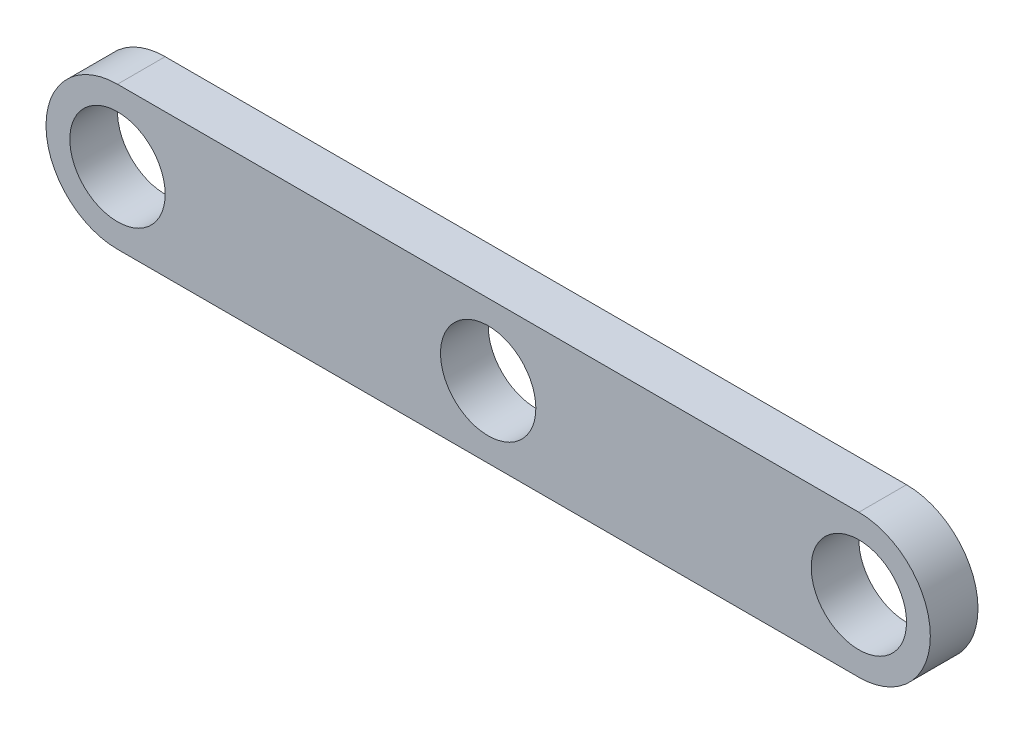
ISO-10303-21;
HEADER;
FILE_DESCRIPTION(('STEP AP214'),'2;1');
FILE_NAME('part.step','',(''),(''),'','','');
FILE_SCHEMA(('AUTOMOTIVE_DESIGN { 1 0 10303 214 1 1 1 1 }'));
ENDSEC;
DATA;
#1=APPLICATION_CONTEXT('core data for automotive mechanical design processes');
#2=APPLICATION_PROTOCOL_DEFINITION('international standard','automotive_design',2000,#1);
#3=PRODUCT_CONTEXT('',#1,'mechanical');
#4=PRODUCT('Part','Part','',(#3));
#5=PRODUCT_RELATED_PRODUCT_CATEGORY('part','',(#4));
#6=PRODUCT_DEFINITION_FORMATION('','',#4);
#7=PRODUCT_DEFINITION_CONTEXT('part definition',#1,'design');
#8=PRODUCT_DEFINITION('design','',#6,#7);
#9=PRODUCT_DEFINITION_SHAPE('','',#8);
#10=(LENGTH_UNIT() NAMED_UNIT(*) SI_UNIT(.MILLI.,.METRE.));
#11=(NAMED_UNIT(*) PLANE_ANGLE_UNIT() SI_UNIT($,.RADIAN.));
#12=(NAMED_UNIT(*) SI_UNIT($,.STERADIAN.) SOLID_ANGLE_UNIT());
#13=UNCERTAINTY_MEASURE_WITH_UNIT(LENGTH_MEASURE(1.E-05),#10,'distance_accuracy_value','');
#14=(GEOMETRIC_REPRESENTATION_CONTEXT(3) GLOBAL_UNCERTAINTY_ASSIGNED_CONTEXT((#13)) GLOBAL_UNIT_ASSIGNED_CONTEXT((#10,
#11,#12)) REPRESENTATION_CONTEXT('',''));
#15=CARTESIAN_POINT('',(0.,0.,0.));
#16=DIRECTION('',(0.,0.,1.));
#17=DIRECTION('',(1.,0.,0.));
#18=AXIS2_PLACEMENT_3D('',#15,#16,#17);
#19=CARTESIAN_POINT('',(-77.7781841228112,0.,10.));
#20=DIRECTION('',(0.,0.,1.));
#21=DIRECTION('',(1.,0.,0.));
#22=AXIS2_PLACEMENT_3D('',#19,#20,#21);
#23=PLANE('',#22);
#24=CARTESIAN_POINT('',(77.7781841228112,0.,10.));
#25=DIRECTION('',(0.,0.,1.));
#26=DIRECTION('',(1.,0.,0.));
#27=AXIS2_PLACEMENT_3D('',#24,#25,#26);
#28=CIRCLE('',#27,9.99999999999999);
#29=CARTESIAN_POINT('',(87.7781841228111,0.,10.));
#30=VERTEX_POINT('',#29);
#31=EDGE_CURVE('E115',#30,#30,#28,.T.);
#32=ORIENTED_EDGE('',*,*,#31,.F.);
#33=EDGE_LOOP('',(#32));
#34=FACE_BOUND('',#33,.T.);
#35=CARTESIAN_POINT('',(-77.7781841228112,0.,10.));
#36=DIRECTION('',(0.,0.,1.));
#37=DIRECTION('',(1.,0.,0.));
#38=AXIS2_PLACEMENT_3D('',#35,#36,#37);
#39=CIRCLE('',#38,15.);
#40=CARTESIAN_POINT('',(-77.7781841228112,15.,10.));
#41=VERTEX_POINT('',#40);
#42=CARTESIAN_POINT('',(-77.7781841228112,-15.,10.));
#43=VERTEX_POINT('',#42);
#44=EDGE_CURVE('E85',#41,#43,#39,.T.);
#45=ORIENTED_EDGE('',*,*,#44,.T.);
#46=DIRECTION('',(1.,0.,0.));
#47=VECTOR('',#46,1.);
#48=CARTESIAN_POINT('',(-77.7781841228112,-15.,10.));
#49=LINE('',#48,#47);
#50=CARTESIAN_POINT('',(77.7781841228112,-15.,10.));
#51=VERTEX_POINT('',#50);
#52=EDGE_CURVE('E80',#43,#51,#49,.T.);
#53=ORIENTED_EDGE('',*,*,#52,.T.);
#54=CARTESIAN_POINT('',(77.7781841228112,0.,10.));
#55=DIRECTION('',(0.,0.,1.));
#56=DIRECTION('',(1.,0.,0.));
#57=AXIS2_PLACEMENT_3D('',#54,#55,#56);
#58=CIRCLE('',#57,15.);
#59=CARTESIAN_POINT('',(77.7781841228112,15.,10.));
#60=VERTEX_POINT('',#59);
#61=EDGE_CURVE('E83',#51,#60,#58,.T.);
#62=ORIENTED_EDGE('',*,*,#61,.T.);
#63=DIRECTION('',(-1.,0.,0.));
#64=VECTOR('',#63,1.);
#65=CARTESIAN_POINT('',(-77.7781841228112,15.,10.));
#66=LINE('',#65,#64);
#67=EDGE_CURVE('E50',#60,#41,#66,.T.);
#68=ORIENTED_EDGE('',*,*,#67,.T.);
#69=EDGE_LOOP('',(#45,#53,#62,#68));
#70=FACE_BOUND('',#69,.T.);
#71=CARTESIAN_POINT('',(-77.7781841228112,0.,10.));
#72=DIRECTION('',(0.,0.,1.));
#73=DIRECTION('',(1.,0.,0.));
#74=AXIS2_PLACEMENT_3D('',#71,#72,#73);
#75=CIRCLE('',#74,9.99999999999999);
#76=CARTESIAN_POINT('',(-67.7781841228112,0.,10.));
#77=VERTEX_POINT('',#76);
#78=EDGE_CURVE('E100',#77,#77,#75,.T.);
#79=ORIENTED_EDGE('',*,*,#78,.F.);
#80=EDGE_LOOP('',(#79));
#81=FACE_BOUND('',#80,.T.);
#82=CARTESIAN_POINT('',(0.,0.,10.));
#83=DIRECTION('',(0.,0.,1.));
#84=DIRECTION('',(1.,0.,0.));
#85=AXIS2_PLACEMENT_3D('',#82,#83,#84);
#86=CIRCLE('',#85,10.);
#87=CARTESIAN_POINT('',(10.,0.,10.));
#88=VERTEX_POINT('',#87);
#89=EDGE_CURVE('E121',#88,#88,#86,.T.);
#90=ORIENTED_EDGE('',*,*,#89,.F.);
#91=EDGE_LOOP('',(#90));
#92=FACE_BOUND('',#91,.T.);
#93=ADVANCED_FACE('F33',(#34,#70,#81,#92),#23,.T.);
#94=CARTESIAN_POINT('',(-77.7781841228112,0.,0.));
#95=DIRECTION('',(0.,0.,1.));
#96=DIRECTION('',(1.,0.,0.));
#97=AXIS2_PLACEMENT_3D('',#94,#95,#96);
#98=PLANE('',#97);
#99=CARTESIAN_POINT('',(-77.7781841228112,0.,0.));
#100=DIRECTION('',(0.,0.,1.));
#101=DIRECTION('',(1.,0.,0.));
#102=AXIS2_PLACEMENT_3D('',#99,#100,#101);
#103=CIRCLE('',#102,15.);
#104=CARTESIAN_POINT('',(-77.7781841228112,15.,0.));
#105=VERTEX_POINT('',#104);
#106=CARTESIAN_POINT('',(-77.7781841228112,-15.,0.));
#107=VERTEX_POINT('',#106);
#108=EDGE_CURVE('E97',#105,#107,#103,.T.);
#109=ORIENTED_EDGE('',*,*,#108,.F.);
#110=DIRECTION('',(-1.,0.,0.));
#111=VECTOR('',#110,1.);
#112=CARTESIAN_POINT('',(-77.7781841228112,15.,0.));
#113=LINE('',#112,#111);
#114=CARTESIAN_POINT('',(77.7781841228112,15.,0.));
#115=VERTEX_POINT('',#114);
#116=EDGE_CURVE('E73',#115,#105,#113,.T.);
#117=ORIENTED_EDGE('',*,*,#116,.F.);
#118=CARTESIAN_POINT('',(77.7781841228112,0.,0.));
#119=DIRECTION('',(0.,0.,1.));
#120=DIRECTION('',(1.,0.,0.));
#121=AXIS2_PLACEMENT_3D('',#118,#119,#120);
#122=CIRCLE('',#121,15.);
#123=CARTESIAN_POINT('',(77.7781841228112,-15.,0.));
#124=VERTEX_POINT('',#123);
#125=EDGE_CURVE('E67',#124,#115,#122,.T.);
#126=ORIENTED_EDGE('',*,*,#125,.F.);
#127=DIRECTION('',(1.,0.,0.));
#128=VECTOR('',#127,1.);
#129=CARTESIAN_POINT('',(-77.7781841228112,-15.,0.));
#130=LINE('',#129,#128);
#131=EDGE_CURVE('E89',#107,#124,#130,.T.);
#132=ORIENTED_EDGE('',*,*,#131,.F.);
#133=EDGE_LOOP('',(#109,#117,#126,#132));
#134=FACE_BOUND('',#133,.T.);
#135=CARTESIAN_POINT('',(-77.7781841228112,0.,0.));
#136=DIRECTION('',(0.,0.,1.));
#137=DIRECTION('',(1.,0.,0.));
#138=AXIS2_PLACEMENT_3D('',#135,#136,#137);
#139=CIRCLE('',#138,9.99999999999999);
#140=CARTESIAN_POINT('',(-67.7781841228112,0.,0.));
#141=VERTEX_POINT('',#140);
#142=EDGE_CURVE('E112',#141,#141,#139,.T.);
#143=ORIENTED_EDGE('',*,*,#142,.T.);
#144=EDGE_LOOP('',(#143));
#145=FACE_BOUND('',#144,.T.);
#146=CARTESIAN_POINT('',(77.7781841228112,0.,0.));
#147=DIRECTION('',(0.,0.,1.));
#148=DIRECTION('',(1.,0.,0.));
#149=AXIS2_PLACEMENT_3D('',#146,#147,#148);
#150=CIRCLE('',#149,9.99999999999999);
#151=CARTESIAN_POINT('',(87.7781841228111,0.,0.));
#152=VERTEX_POINT('',#151);
#153=EDGE_CURVE('E118',#152,#152,#150,.T.);
#154=ORIENTED_EDGE('',*,*,#153,.T.);
#155=EDGE_LOOP('',(#154));
#156=FACE_BOUND('',#155,.T.);
#157=CARTESIAN_POINT('',(0.,0.,0.));
#158=DIRECTION('',(0.,0.,1.));
#159=DIRECTION('',(1.,0.,0.));
#160=AXIS2_PLACEMENT_3D('',#157,#158,#159);
#161=CIRCLE('',#160,10.);
#162=CARTESIAN_POINT('',(10.,0.,0.));
#163=VERTEX_POINT('',#162);
#164=EDGE_CURVE('E124',#163,#163,#161,.T.);
#165=ORIENTED_EDGE('',*,*,#164,.T.);
#166=EDGE_LOOP('',(#165));
#167=FACE_BOUND('',#166,.T.);
#168=ADVANCED_FACE('F108',(#134,#145,#156,#167),#98,.F.);
#169=CARTESIAN_POINT('',(-77.7781841228112,0.,10.));
#170=DIRECTION('',(0.,0.,-1.));
#171=DIRECTION('',(-1.,0.,0.));
#172=AXIS2_PLACEMENT_3D('',#169,#170,#171);
#173=CYLINDRICAL_SURFACE('',#172,15.);
#174=ORIENTED_EDGE('',*,*,#108,.T.);
#175=DIRECTION('',(0.,0.,-1.));
#176=VECTOR('',#175,1.);
#177=CARTESIAN_POINT('',(-77.7781841228112,-15.,10.));
#178=LINE('',#177,#176);
#179=EDGE_CURVE('E11',#43,#107,#178,.T.);
#180=ORIENTED_EDGE('',*,*,#179,.F.);
#181=ORIENTED_EDGE('',*,*,#44,.F.);
#182=DIRECTION('',(0.,0.,-1.));
#183=VECTOR('',#182,1.);
#184=CARTESIAN_POINT('',(-77.7781841228112,15.,10.));
#185=LINE('',#184,#183);
#186=EDGE_CURVE('E93',#41,#105,#185,.T.);
#187=ORIENTED_EDGE('',*,*,#186,.T.);
#188=EDGE_LOOP('',(#174,#180,#181,#187));
#189=FACE_BOUND('',#188,.T.);
#190=ADVANCED_FACE('F35',(#189),#173,.T.);
#191=CARTESIAN_POINT('',(-77.7781841228112,-15.,10.));
#192=DIRECTION('',(0.,1.,0.));
#193=DIRECTION('',(-1.,0.,0.));
#194=AXIS2_PLACEMENT_3D('',#191,#192,#193);
#195=PLANE('',#194);
#196=ORIENTED_EDGE('',*,*,#131,.T.);
#197=DIRECTION('',(0.,0.,-1.));
#198=VECTOR('',#197,1.);
#199=CARTESIAN_POINT('',(77.7781841228112,-15.,10.));
#200=LINE('',#199,#198);
#201=EDGE_CURVE('E42',#51,#124,#200,.T.);
#202=ORIENTED_EDGE('',*,*,#201,.F.);
#203=ORIENTED_EDGE('',*,*,#52,.F.);
#204=ORIENTED_EDGE('',*,*,#179,.T.);
#205=EDGE_LOOP('',(#196,#202,#203,#204));
#206=FACE_BOUND('',#205,.T.);
#207=ADVANCED_FACE('F88',(#206),#195,.F.);
#208=CARTESIAN_POINT('',(77.7781841228112,0.,10.));
#209=DIRECTION('',(0.,0.,-1.));
#210=DIRECTION('',(-1.,0.,0.));
#211=AXIS2_PLACEMENT_3D('',#208,#209,#210);
#212=CYLINDRICAL_SURFACE('',#211,15.);
#213=ORIENTED_EDGE('',*,*,#125,.T.);
#214=DIRECTION('',(0.,0.,-1.));
#215=VECTOR('',#214,1.);
#216=CARTESIAN_POINT('',(77.7781841228112,15.,10.));
#217=LINE('',#216,#215);
#218=EDGE_CURVE('E90',#60,#115,#217,.T.);
#219=ORIENTED_EDGE('',*,*,#218,.F.);
#220=ORIENTED_EDGE('',*,*,#61,.F.);
#221=ORIENTED_EDGE('',*,*,#201,.T.);
#222=EDGE_LOOP('',(#213,#219,#220,#221));
#223=FACE_BOUND('',#222,.T.);
#224=ADVANCED_FACE('F91',(#223),#212,.T.);
#225=CARTESIAN_POINT('',(-77.7781841228112,15.,10.));
#226=DIRECTION('',(0.,-1.,0.));
#227=DIRECTION('',(1.,0.,0.));
#228=AXIS2_PLACEMENT_3D('',#225,#226,#227);
#229=PLANE('',#228);
#230=ORIENTED_EDGE('',*,*,#116,.T.);
#231=ORIENTED_EDGE('',*,*,#186,.F.);
#232=ORIENTED_EDGE('',*,*,#67,.F.);
#233=ORIENTED_EDGE('',*,*,#218,.T.);
#234=EDGE_LOOP('',(#230,#231,#232,#233));
#235=FACE_BOUND('',#234,.T.);
#236=ADVANCED_FACE('F105',(#235),#229,.F.);
#237=CARTESIAN_POINT('',(-77.7781841228112,0.,10.));
#238=DIRECTION('',(0.,0.,-1.));
#239=DIRECTION('',(-1.,0.,0.));
#240=AXIS2_PLACEMENT_3D('',#237,#238,#239);
#241=CYLINDRICAL_SURFACE('',#240,9.99999999999999);
#242=ORIENTED_EDGE('',*,*,#78,.T.);
#243=EDGE_LOOP('',(#242));
#244=FACE_BOUND('',#243,.T.);
#245=ORIENTED_EDGE('',*,*,#142,.F.);
#246=EDGE_LOOP('',(#245));
#247=FACE_BOUND('',#246,.T.);
#248=ADVANCED_FACE('F142',(#244,#247),#241,.F.);
#249=CARTESIAN_POINT('',(77.7781841228112,0.,10.));
#250=DIRECTION('',(0.,0.,-1.));
#251=DIRECTION('',(-1.,0.,0.));
#252=AXIS2_PLACEMENT_3D('',#249,#250,#251);
#253=CYLINDRICAL_SURFACE('',#252,9.99999999999999);
#254=ORIENTED_EDGE('',*,*,#31,.T.);
#255=EDGE_LOOP('',(#254));
#256=FACE_BOUND('',#255,.T.);
#257=ORIENTED_EDGE('',*,*,#153,.F.);
#258=EDGE_LOOP('',(#257));
#259=FACE_BOUND('',#258,.T.);
#260=ADVANCED_FACE('F188',(#256,#259),#253,.F.);
#261=CARTESIAN_POINT('',(0.,0.,10.));
#262=DIRECTION('',(0.,0.,-1.));
#263=DIRECTION('',(-1.,0.,0.));
#264=AXIS2_PLACEMENT_3D('',#261,#262,#263);
#265=CYLINDRICAL_SURFACE('',#264,10.);
#266=ORIENTED_EDGE('',*,*,#89,.T.);
#267=EDGE_LOOP('',(#266));
#268=FACE_BOUND('',#267,.T.);
#269=ORIENTED_EDGE('',*,*,#164,.F.);
#270=EDGE_LOOP('',(#269));
#271=FACE_BOUND('',#270,.T.);
#272=ADVANCED_FACE('F130',(#268,#271),#265,.F.);
#273=CLOSED_SHELL('',(#93,#168,#190,#207,#224,#236,#248,#260,#272));
#274=MANIFOLD_SOLID_BREP('B2',#273);
#275=ADVANCED_BREP_SHAPE_REPRESENTATION('',(#18,#274),#14);
#276=SHAPE_DEFINITION_REPRESENTATION(#9,#275);
ENDSEC;
END-ISO-10303-21;
